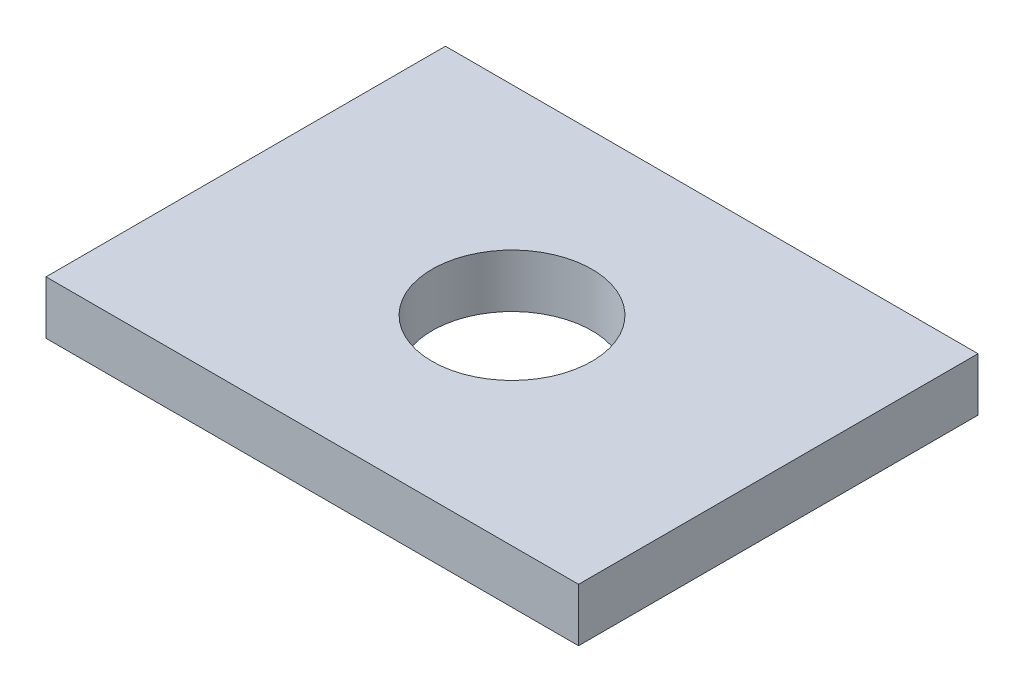
ISO-10303-21;
HEADER;
FILE_DESCRIPTION(('STEP AP214'),'2;1');
FILE_NAME('part.step','',(''),(''),'','','');
FILE_SCHEMA(('AUTOMOTIVE_DESIGN { 1 0 10303 214 1 1 1 1 }'));
ENDSEC;
DATA;
#1=APPLICATION_CONTEXT('core data for automotive mechanical design processes');
#2=APPLICATION_PROTOCOL_DEFINITION('international standard','automotive_design',2000,#1);
#3=PRODUCT_CONTEXT('',#1,'mechanical');
#4=PRODUCT('Part','Part','',(#3));
#5=PRODUCT_RELATED_PRODUCT_CATEGORY('part','',(#4));
#6=PRODUCT_DEFINITION_FORMATION('','',#4);
#7=PRODUCT_DEFINITION_CONTEXT('part definition',#1,'design');
#8=PRODUCT_DEFINITION('design','',#6,#7);
#9=PRODUCT_DEFINITION_SHAPE('','',#8);
#10=(LENGTH_UNIT() NAMED_UNIT(*) SI_UNIT(.MILLI.,.METRE.));
#11=(NAMED_UNIT(*) PLANE_ANGLE_UNIT() SI_UNIT($,.RADIAN.));
#12=(NAMED_UNIT(*) SI_UNIT($,.STERADIAN.) SOLID_ANGLE_UNIT());
#13=UNCERTAINTY_MEASURE_WITH_UNIT(LENGTH_MEASURE(1.E-05),#10,'distance_accuracy_value','');
#14=(GEOMETRIC_REPRESENTATION_CONTEXT(3) GLOBAL_UNCERTAINTY_ASSIGNED_CONTEXT((#13)) GLOBAL_UNIT_ASSIGNED_CONTEXT((#10,
#11,#12)) REPRESENTATION_CONTEXT('',''));
#15=CARTESIAN_POINT('',(0.,0.,0.));
#16=DIRECTION('',(0.,0.,1.));
#17=DIRECTION('',(1.,0.,0.));
#18=AXIS2_PLACEMENT_3D('',#15,#16,#17);
#19=CARTESIAN_POINT('',(12.7,2.54,9.525));
#20=DIRECTION('',(-1.,0.,0.));
#21=DIRECTION('',(0.,0.,1.));
#22=AXIS2_PLACEMENT_3D('',#19,#20,#21);
#23=PLANE('',#22);
#24=DIRECTION('',(0.,0.,-1.));
#25=VECTOR('',#24,1.);
#26=CARTESIAN_POINT('',(12.7,0.,9.525));
#27=LINE('',#26,#25);
#28=CARTESIAN_POINT('',(12.7,0.,9.525));
#29=VERTEX_POINT('',#28);
#30=CARTESIAN_POINT('',(12.7,0.,-9.525));
#31=VERTEX_POINT('',#30);
#32=EDGE_CURVE('E100',#29,#31,#27,.T.);
#33=ORIENTED_EDGE('',*,*,#32,.T.);
#34=DIRECTION('',(0.,-1.,0.));
#35=VECTOR('',#34,1.);
#36=CARTESIAN_POINT('',(12.7,2.54,-9.525));
#37=LINE('',#36,#35);
#38=CARTESIAN_POINT('',(12.7,2.54,-9.525));
#39=VERTEX_POINT('',#38);
#40=EDGE_CURVE('E11',#39,#31,#37,.T.);
#41=ORIENTED_EDGE('',*,*,#40,.F.);
#42=DIRECTION('',(0.,0.,-1.));
#43=VECTOR('',#42,1.);
#44=CARTESIAN_POINT('',(12.7,2.54,9.525));
#45=LINE('',#44,#43);
#46=CARTESIAN_POINT('',(12.7,2.54,9.525));
#47=VERTEX_POINT('',#46);
#48=EDGE_CURVE('E88',#47,#39,#45,.T.);
#49=ORIENTED_EDGE('',*,*,#48,.F.);
#50=DIRECTION('',(0.,-1.,0.));
#51=VECTOR('',#50,1.);
#52=CARTESIAN_POINT('',(12.7,2.54,9.525));
#53=LINE('',#52,#51);
#54=EDGE_CURVE('E96',#47,#29,#53,.T.);
#55=ORIENTED_EDGE('',*,*,#54,.T.);
#56=EDGE_LOOP('',(#33,#41,#49,#55));
#57=FACE_BOUND('',#56,.T.);
#58=ADVANCED_FACE('F37',(#57),#23,.F.);
#59=CARTESIAN_POINT('',(-12.7,2.54,-9.525));
#60=DIRECTION('',(0.,0.,1.));
#61=DIRECTION('',(1.,0.,0.));
#62=AXIS2_PLACEMENT_3D('',#59,#60,#61);
#63=PLANE('',#62);
#64=DIRECTION('',(-1.,0.,0.));
#65=VECTOR('',#64,1.);
#66=CARTESIAN_POINT('',(-12.7,0.,-9.525));
#67=LINE('',#66,#65);
#68=CARTESIAN_POINT('',(-12.7,0.,-9.525));
#69=VERTEX_POINT('',#68);
#70=EDGE_CURVE('E92',#31,#69,#67,.T.);
#71=ORIENTED_EDGE('',*,*,#70,.T.);
#72=DIRECTION('',(0.,-1.,0.));
#73=VECTOR('',#72,1.);
#74=CARTESIAN_POINT('',(-12.7,2.54,-9.525));
#75=LINE('',#74,#73);
#76=CARTESIAN_POINT('',(-12.7,2.54,-9.525));
#77=VERTEX_POINT('',#76);
#78=EDGE_CURVE('E45',#77,#69,#75,.T.);
#79=ORIENTED_EDGE('',*,*,#78,.F.);
#80=DIRECTION('',(-1.,0.,0.));
#81=VECTOR('',#80,1.);
#82=CARTESIAN_POINT('',(-12.7,2.54,-9.525));
#83=LINE('',#82,#81);
#84=EDGE_CURVE('E83',#39,#77,#83,.T.);
#85=ORIENTED_EDGE('',*,*,#84,.F.);
#86=ORIENTED_EDGE('',*,*,#40,.T.);
#87=EDGE_LOOP('',(#71,#79,#85,#86));
#88=FACE_BOUND('',#87,.T.);
#89=ADVANCED_FACE('F91',(#88),#63,.F.);
#90=CARTESIAN_POINT('',(-12.7,2.54,9.525));
#91=DIRECTION('',(1.,0.,0.));
#92=DIRECTION('',(0.,0.,-1.));
#93=AXIS2_PLACEMENT_3D('',#90,#91,#92);
#94=PLANE('',#93);
#95=DIRECTION('',(0.,0.,1.));
#96=VECTOR('',#95,1.);
#97=CARTESIAN_POINT('',(-12.7,0.,9.525));
#98=LINE('',#97,#96);
#99=CARTESIAN_POINT('',(-12.7,0.,9.525));
#100=VERTEX_POINT('',#99);
#101=EDGE_CURVE('E70',#69,#100,#98,.T.);
#102=ORIENTED_EDGE('',*,*,#101,.T.);
#103=DIRECTION('',(0.,-1.,0.));
#104=VECTOR('',#103,1.);
#105=CARTESIAN_POINT('',(-12.7,2.54,9.525));
#106=LINE('',#105,#104);
#107=CARTESIAN_POINT('',(-12.7,2.54,9.525));
#108=VERTEX_POINT('',#107);
#109=EDGE_CURVE('E93',#108,#100,#106,.T.);
#110=ORIENTED_EDGE('',*,*,#109,.F.);
#111=DIRECTION('',(0.,0.,1.));
#112=VECTOR('',#111,1.);
#113=CARTESIAN_POINT('',(-12.7,2.54,9.525));
#114=LINE('',#113,#112);
#115=EDGE_CURVE('E86',#77,#108,#114,.T.);
#116=ORIENTED_EDGE('',*,*,#115,.F.);
#117=ORIENTED_EDGE('',*,*,#78,.T.);
#118=EDGE_LOOP('',(#102,#110,#116,#117));
#119=FACE_BOUND('',#118,.T.);
#120=ADVANCED_FACE('F94',(#119),#94,.F.);
#121=CARTESIAN_POINT('',(-12.7,2.54,9.525));
#122=DIRECTION('',(0.,0.,-1.));
#123=DIRECTION('',(-1.,0.,0.));
#124=AXIS2_PLACEMENT_3D('',#121,#122,#123);
#125=PLANE('',#124);
#126=DIRECTION('',(1.,0.,0.));
#127=VECTOR('',#126,1.);
#128=CARTESIAN_POINT('',(-12.7,0.,9.525));
#129=LINE('',#128,#127);
#130=EDGE_CURVE('E76',#100,#29,#129,.T.);
#131=ORIENTED_EDGE('',*,*,#130,.T.);
#132=ORIENTED_EDGE('',*,*,#54,.F.);
#133=DIRECTION('',(1.,0.,0.));
#134=VECTOR('',#133,1.);
#135=CARTESIAN_POINT('',(-12.7,2.54,9.525));
#136=LINE('',#135,#134);
#137=EDGE_CURVE('E53',#108,#47,#136,.T.);
#138=ORIENTED_EDGE('',*,*,#137,.F.);
#139=ORIENTED_EDGE('',*,*,#109,.T.);
#140=EDGE_LOOP('',(#131,#132,#138,#139));
#141=FACE_BOUND('',#140,.T.);
#142=ADVANCED_FACE('F108',(#141),#125,.F.);
#143=CARTESIAN_POINT('',(0.,2.54,0.));
#144=DIRECTION('',(0.,-1.,0.));
#145=DIRECTION('',(0.,0.,-1.));
#146=AXIS2_PLACEMENT_3D('',#143,#144,#145);
#147=PLANE('',#146);
#148=CARTESIAN_POINT('',(0.,2.54,0.));
#149=DIRECTION('',(0.,1.,0.));
#150=DIRECTION('',(0.,0.,1.));
#151=AXIS2_PLACEMENT_3D('',#148,#149,#150);
#152=CIRCLE('',#151,3.81);
#153=CARTESIAN_POINT('',(0.,2.54,3.81));
#154=VERTEX_POINT('',#153);
#155=EDGE_CURVE('E114',#154,#154,#152,.T.);
#156=ORIENTED_EDGE('',*,*,#155,.F.);
#157=EDGE_LOOP('',(#156));
#158=FACE_BOUND('',#157,.T.);
#159=ORIENTED_EDGE('',*,*,#48,.T.);
#160=ORIENTED_EDGE('',*,*,#84,.T.);
#161=ORIENTED_EDGE('',*,*,#115,.T.);
#162=ORIENTED_EDGE('',*,*,#137,.T.);
#163=EDGE_LOOP('',(#159,#160,#161,#162));
#164=FACE_BOUND('',#163,.T.);
#165=ADVANCED_FACE('F84',(#158,#164),#147,.F.);
#166=CARTESIAN_POINT('',(0.,0.,0.));
#167=DIRECTION('',(0.,-1.,0.));
#168=DIRECTION('',(0.,0.,-1.));
#169=AXIS2_PLACEMENT_3D('',#166,#167,#168);
#170=PLANE('',#169);
#171=CARTESIAN_POINT('',(0.,0.,0.));
#172=DIRECTION('',(0.,1.,0.));
#173=DIRECTION('',(0.,0.,1.));
#174=AXIS2_PLACEMENT_3D('',#171,#172,#173);
#175=CIRCLE('',#174,3.81);
#176=CARTESIAN_POINT('',(0.,0.,3.81));
#177=VERTEX_POINT('',#176);
#178=EDGE_CURVE('E103',#177,#177,#175,.T.);
#179=ORIENTED_EDGE('',*,*,#178,.T.);
#180=EDGE_LOOP('',(#179));
#181=FACE_BOUND('',#180,.T.);
#182=ORIENTED_EDGE('',*,*,#32,.F.);
#183=ORIENTED_EDGE('',*,*,#130,.F.);
#184=ORIENTED_EDGE('',*,*,#101,.F.);
#185=ORIENTED_EDGE('',*,*,#70,.F.);
#186=EDGE_LOOP('',(#182,#183,#184,#185));
#187=FACE_BOUND('',#186,.T.);
#188=ADVANCED_FACE('F111',(#181,#187),#170,.T.);
#189=CARTESIAN_POINT('',(0.,0.,0.));
#190=DIRECTION('',(0.,1.,0.));
#191=DIRECTION('',(0.,0.,1.));
#192=AXIS2_PLACEMENT_3D('',#189,#190,#191);
#193=CYLINDRICAL_SURFACE('',#192,3.81);
#194=ORIENTED_EDGE('',*,*,#178,.F.);
#195=EDGE_LOOP('',(#194));
#196=FACE_BOUND('',#195,.T.);
#197=ORIENTED_EDGE('',*,*,#155,.T.);
#198=EDGE_LOOP('',(#197));
#199=FACE_BOUND('',#198,.T.);
#200=ADVANCED_FACE('F121',(#196,#199),#193,.F.);
#201=CLOSED_SHELL('',(#58,#89,#120,#142,#165,#188,#200));
#202=MANIFOLD_SOLID_BREP('B2',#201);
#203=ADVANCED_BREP_SHAPE_REPRESENTATION('',(#18,#202),#14);
#204=SHAPE_DEFINITION_REPRESENTATION(#9,#203);
ENDSEC;
END-ISO-10303-21;
